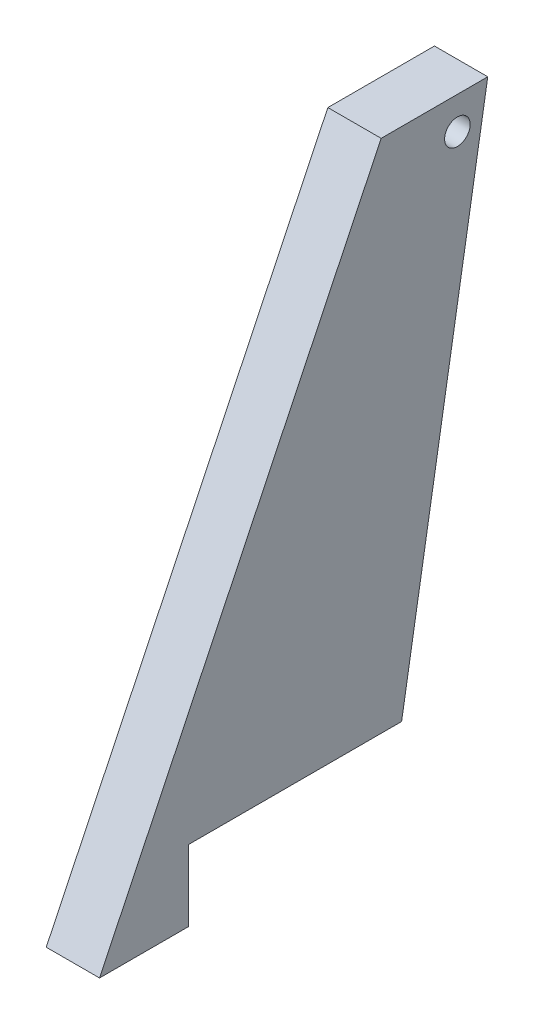
ISO-10303-21;
HEADER;
FILE_DESCRIPTION(('STEP AP214'),'2;1');
FILE_NAME('part.step','',(''),(''),'','','');
FILE_SCHEMA(('AUTOMOTIVE_DESIGN { 1 0 10303 214 1 1 1 1 }'));
ENDSEC;
DATA;
#1=APPLICATION_CONTEXT('core data for automotive mechanical design processes');
#2=APPLICATION_PROTOCOL_DEFINITION('international standard','automotive_design',2000,#1);
#3=PRODUCT_CONTEXT('',#1,'mechanical');
#4=PRODUCT('Part','Part','',(#3));
#5=PRODUCT_RELATED_PRODUCT_CATEGORY('part','',(#4));
#6=PRODUCT_DEFINITION_FORMATION('','',#4);
#7=PRODUCT_DEFINITION_CONTEXT('part definition',#1,'design');
#8=PRODUCT_DEFINITION('design','',#6,#7);
#9=PRODUCT_DEFINITION_SHAPE('','',#8);
#10=(LENGTH_UNIT() NAMED_UNIT(*) SI_UNIT(.MILLI.,.METRE.));
#11=(NAMED_UNIT(*) PLANE_ANGLE_UNIT() SI_UNIT($,.RADIAN.));
#12=(NAMED_UNIT(*) SI_UNIT($,.STERADIAN.) SOLID_ANGLE_UNIT());
#13=UNCERTAINTY_MEASURE_WITH_UNIT(LENGTH_MEASURE(1.E-05),#10,'distance_accuracy_value','');
#14=(GEOMETRIC_REPRESENTATION_CONTEXT(3) GLOBAL_UNCERTAINTY_ASSIGNED_CONTEXT((#13)) GLOBAL_UNIT_ASSIGNED_CONTEXT((#10,
#11,#12)) REPRESENTATION_CONTEXT('',''));
#15=CARTESIAN_POINT('',(0.,0.,0.));
#16=DIRECTION('',(0.,0.,1.));
#17=DIRECTION('',(1.,0.,0.));
#18=AXIS2_PLACEMENT_3D('',#15,#16,#17);
#19=CARTESIAN_POINT('',(9.525,12.7,0.));
#20=DIRECTION('',(0.,0.,1.));
#21=DIRECTION('',(0.,-1.,0.));
#22=AXIS2_PLACEMENT_3D('',#19,#20,#21);
#23=PLANE('',#22);
#24=DIRECTION('',(0.,1.,0.));
#25=VECTOR('',#24,1.);
#26=CARTESIAN_POINT('',(0.,12.7,0.));
#27=LINE('',#26,#25);
#28=CARTESIAN_POINT('',(0.,0.,0.));
#29=VERTEX_POINT('',#28);
#30=CARTESIAN_POINT('',(0.,12.7,0.));
#31=VERTEX_POINT('',#30);
#32=EDGE_CURVE('E123',#29,#31,#27,.T.);
#33=ORIENTED_EDGE('',*,*,#32,.T.);
#34=DIRECTION('',(-1.,0.,0.));
#35=VECTOR('',#34,1.);
#36=CARTESIAN_POINT('',(9.525,12.7,0.));
#37=LINE('',#36,#35);
#38=CARTESIAN_POINT('',(9.525,12.7,0.));
#39=VERTEX_POINT('',#38);
#40=EDGE_CURVE('E11',#39,#31,#37,.T.);
#41=ORIENTED_EDGE('',*,*,#40,.F.);
#42=DIRECTION('',(0.,1.,0.));
#43=VECTOR('',#42,1.);
#44=CARTESIAN_POINT('',(9.525,12.7,0.));
#45=LINE('',#44,#43);
#46=CARTESIAN_POINT('',(9.525,0.,0.));
#47=VERTEX_POINT('',#46);
#48=EDGE_CURVE('E134',#47,#39,#45,.T.);
#49=ORIENTED_EDGE('',*,*,#48,.F.);
#50=DIRECTION('',(-1.,0.,0.));
#51=VECTOR('',#50,1.);
#52=CARTESIAN_POINT('',(9.525,0.,0.));
#53=LINE('',#52,#51);
#54=EDGE_CURVE('E119',#47,#29,#53,.T.);
#55=ORIENTED_EDGE('',*,*,#54,.T.);
#56=EDGE_LOOP('',(#33,#41,#49,#55));
#57=FACE_BOUND('',#56,.T.);
#58=ADVANCED_FACE('F39',(#57),#23,.F.);
#59=CARTESIAN_POINT('',(9.525,12.7,0.));
#60=DIRECTION('',(0.,1.,0.));
#61=DIRECTION('',(0.,0.,1.));
#62=AXIS2_PLACEMENT_3D('',#59,#60,#61);
#63=PLANE('',#62);
#64=DIRECTION('',(0.,0.,-1.));
#65=VECTOR('',#64,1.);
#66=CARTESIAN_POINT('',(0.,12.7,0.));
#67=LINE('',#66,#65);
#68=CARTESIAN_POINT('',(0.,12.7,-38.1));
#69=VERTEX_POINT('',#68);
#70=EDGE_CURVE('E126',#31,#69,#67,.T.);
#71=ORIENTED_EDGE('',*,*,#70,.T.);
#72=DIRECTION('',(-1.,0.,0.));
#73=VECTOR('',#72,1.);
#74=CARTESIAN_POINT('',(9.525,12.7,-38.1));
#75=LINE('',#74,#73);
#76=CARTESIAN_POINT('',(9.525,12.7,-38.1));
#77=VERTEX_POINT('',#76);
#78=EDGE_CURVE('E47',#77,#69,#75,.T.);
#79=ORIENTED_EDGE('',*,*,#78,.F.);
#80=DIRECTION('',(0.,0.,-1.));
#81=VECTOR('',#80,1.);
#82=CARTESIAN_POINT('',(9.525,12.7,0.));
#83=LINE('',#82,#81);
#84=EDGE_CURVE('E92',#39,#77,#83,.T.);
#85=ORIENTED_EDGE('',*,*,#84,.F.);
#86=ORIENTED_EDGE('',*,*,#40,.T.);
#87=EDGE_LOOP('',(#71,#79,#85,#86));
#88=FACE_BOUND('',#87,.T.);
#89=ADVANCED_FACE('F159',(#88),#63,.F.);
#90=CARTESIAN_POINT('',(9.525,12.7,-38.1));
#91=DIRECTION('',(0.,0.164906025181086,0.986309283571322));
#92=DIRECTION('',(0.,-0.986309283571322,0.164906025181086));
#93=AXIS2_PLACEMENT_3D('',#90,#91,#92);
#94=PLANE('',#93);
#95=DIRECTION('',(0.,0.986309283571322,-0.164906025181086));
#96=VECTOR('',#95,1.);
#97=CARTESIAN_POINT('',(0.,12.7,-38.1));
#98=LINE('',#97,#96);
#99=CARTESIAN_POINT('',(0.,104.775,-53.494483780554));
#100=VERTEX_POINT('',#99);
#101=EDGE_CURVE('E129',#69,#100,#98,.T.);
#102=ORIENTED_EDGE('',*,*,#101,.T.);
#103=DIRECTION('',(-1.,0.,0.));
#104=VECTOR('',#103,1.);
#105=CARTESIAN_POINT('',(9.525,104.775,-53.494483780554));
#106=LINE('',#105,#104);
#107=CARTESIAN_POINT('',(9.525,104.775,-53.494483780554));
#108=VERTEX_POINT('',#107);
#109=EDGE_CURVE('E114',#108,#100,#106,.T.);
#110=ORIENTED_EDGE('',*,*,#109,.F.);
#111=DIRECTION('',(0.,0.986309283571322,-0.164906025181086));
#112=VECTOR('',#111,1.);
#113=CARTESIAN_POINT('',(9.525,12.7,-38.1));
#114=LINE('',#113,#112);
#115=EDGE_CURVE('E105',#77,#108,#114,.T.);
#116=ORIENTED_EDGE('',*,*,#115,.F.);
#117=ORIENTED_EDGE('',*,*,#78,.T.);
#118=EDGE_LOOP('',(#102,#110,#116,#117));
#119=FACE_BOUND('',#118,.T.);
#120=ADVANCED_FACE('F140',(#119),#94,.F.);
#121=CARTESIAN_POINT('',(9.525,104.775,-53.494483780554));
#122=DIRECTION('',(0.,-1.,0.));
#123=DIRECTION('',(0.,0.,-1.));
#124=AXIS2_PLACEMENT_3D('',#121,#122,#123);
#125=PLANE('',#124);
#126=DIRECTION('',(0.,0.,1.));
#127=VECTOR('',#126,1.);
#128=CARTESIAN_POINT('',(0.,104.775,-53.494483780554));
#129=LINE('',#128,#127);
#130=CARTESIAN_POINT('',(0.,104.775,-34.444483780554));
#131=VERTEX_POINT('',#130);
#132=EDGE_CURVE('E113',#100,#131,#129,.T.);
#133=ORIENTED_EDGE('',*,*,#132,.T.);
#134=DIRECTION('',(-1.,0.,0.));
#135=VECTOR('',#134,1.);
#136=CARTESIAN_POINT('',(9.525,104.775,-34.444483780554));
#137=LINE('',#136,#135);
#138=CARTESIAN_POINT('',(9.525,104.775,-34.444483780554));
#139=VERTEX_POINT('',#138);
#140=EDGE_CURVE('E110',#139,#131,#137,.T.);
#141=ORIENTED_EDGE('',*,*,#140,.F.);
#142=DIRECTION('',(0.,0.,1.));
#143=VECTOR('',#142,1.);
#144=CARTESIAN_POINT('',(9.525,104.775,-53.494483780554));
#145=LINE('',#144,#143);
#146=EDGE_CURVE('E99',#108,#139,#145,.T.);
#147=ORIENTED_EDGE('',*,*,#146,.F.);
#148=ORIENTED_EDGE('',*,*,#109,.T.);
#149=EDGE_LOOP('',(#133,#141,#147,#148));
#150=FACE_BOUND('',#149,.T.);
#151=ADVANCED_FACE('F111',(#150),#125,.F.);
#152=CARTESIAN_POINT('',(9.525,0.,15.875));
#153=DIRECTION('',(0.,-0.432923236283564,-0.901430791290027));
#154=DIRECTION('',(0.,0.901430791290027,-0.432923236283564));
#155=AXIS2_PLACEMENT_3D('',#152,#153,#154);
#156=PLANE('',#155);
#157=DIRECTION('',(0.,-0.901430791290027,0.432923236283565));
#158=VECTOR('',#157,1.);
#159=CARTESIAN_POINT('',(0.,0.,15.875));
#160=LINE('',#159,#158);
#161=CARTESIAN_POINT('',(0.,0.,15.875));
#162=VERTEX_POINT('',#161);
#163=EDGE_CURVE('E78',#131,#162,#160,.T.);
#164=ORIENTED_EDGE('',*,*,#163,.T.);
#165=DIRECTION('',(-1.,0.,0.));
#166=VECTOR('',#165,1.);
#167=CARTESIAN_POINT('',(9.525,0.,15.875));
#168=LINE('',#167,#166);
#169=CARTESIAN_POINT('',(9.525,0.,15.875));
#170=VERTEX_POINT('',#169);
#171=EDGE_CURVE('E115',#170,#162,#168,.T.);
#172=ORIENTED_EDGE('',*,*,#171,.F.);
#173=DIRECTION('',(0.,-0.901430791290027,0.432923236283565));
#174=VECTOR('',#173,1.);
#175=CARTESIAN_POINT('',(9.525,0.,15.875));
#176=LINE('',#175,#174);
#177=EDGE_CURVE('E103',#139,#170,#176,.T.);
#178=ORIENTED_EDGE('',*,*,#177,.F.);
#179=ORIENTED_EDGE('',*,*,#140,.T.);
#180=EDGE_LOOP('',(#164,#172,#178,#179));
#181=FACE_BOUND('',#180,.T.);
#182=ADVANCED_FACE('F117',(#181),#156,.F.);
#183=CARTESIAN_POINT('',(9.525,0.,0.));
#184=DIRECTION('',(0.,1.,0.));
#185=DIRECTION('',(0.,0.,1.));
#186=AXIS2_PLACEMENT_3D('',#183,#184,#185);
#187=PLANE('',#186);
#188=DIRECTION('',(0.,0.,-1.));
#189=VECTOR('',#188,1.);
#190=CARTESIAN_POINT('',(0.,0.,0.));
#191=LINE('',#190,#189);
#192=EDGE_CURVE('E84',#162,#29,#191,.T.);
#193=ORIENTED_EDGE('',*,*,#192,.T.);
#194=ORIENTED_EDGE('',*,*,#54,.F.);
#195=DIRECTION('',(0.,0.,-1.));
#196=VECTOR('',#195,1.);
#197=CARTESIAN_POINT('',(9.525,0.,0.));
#198=LINE('',#197,#196);
#199=EDGE_CURVE('E55',#170,#47,#198,.T.);
#200=ORIENTED_EDGE('',*,*,#199,.F.);
#201=ORIENTED_EDGE('',*,*,#171,.T.);
#202=EDGE_LOOP('',(#193,#194,#200,#201));
#203=FACE_BOUND('',#202,.T.);
#204=ADVANCED_FACE('F147',(#203),#187,.F.);
#205=CARTESIAN_POINT('',(9.525,0.,0.));
#206=DIRECTION('',(-1.,0.,0.));
#207=DIRECTION('',(0.,0.,1.));
#208=AXIS2_PLACEMENT_3D('',#205,#206,#207);
#209=PLANE('',#208);
#210=CARTESIAN_POINT('',(9.525,98.9886403156559,-48.0671622489861));
#211=DIRECTION('',(-1.,0.,0.));
#212=DIRECTION('',(0.,0.,1.));
#213=AXIS2_PLACEMENT_3D('',#210,#211,#212);
#214=CIRCLE('',#213,2.28599999999999);
#215=CARTESIAN_POINT('',(9.525,98.9886403156559,-45.7811622489861));
#216=VERTEX_POINT('',#215);
#217=EDGE_CURVE('E127',#216,#216,#214,.T.);
#218=ORIENTED_EDGE('',*,*,#217,.T.);
#219=EDGE_LOOP('',(#218));
#220=FACE_BOUND('',#219,.T.);
#221=ORIENTED_EDGE('',*,*,#48,.T.);
#222=ORIENTED_EDGE('',*,*,#84,.T.);
#223=ORIENTED_EDGE('',*,*,#115,.T.);
#224=ORIENTED_EDGE('',*,*,#146,.T.);
#225=ORIENTED_EDGE('',*,*,#177,.T.);
#226=ORIENTED_EDGE('',*,*,#199,.T.);
#227=EDGE_LOOP('',(#221,#222,#223,#224,#225,#226));
#228=FACE_BOUND('',#227,.T.);
#229=ADVANCED_FACE('F101',(#220,#228),#209,.F.);
#230=CARTESIAN_POINT('',(0.,0.,0.));
#231=DIRECTION('',(-1.,0.,0.));
#232=DIRECTION('',(0.,0.,1.));
#233=AXIS2_PLACEMENT_3D('',#230,#231,#232);
#234=PLANE('',#233);
#235=CARTESIAN_POINT('',(0.,98.9886403156559,-48.0671622489861));
#236=DIRECTION('',(-1.,0.,0.));
#237=DIRECTION('',(0.,0.,1.));
#238=AXIS2_PLACEMENT_3D('',#235,#236,#237);
#239=CIRCLE('',#238,2.28599999999999);
#240=CARTESIAN_POINT('',(0.,98.9886403156559,-45.7811622489861));
#241=VERTEX_POINT('',#240);
#242=EDGE_CURVE('E215',#241,#241,#239,.T.);
#243=ORIENTED_EDGE('',*,*,#242,.F.);
#244=EDGE_LOOP('',(#243));
#245=FACE_BOUND('',#244,.T.);
#246=ORIENTED_EDGE('',*,*,#32,.F.);
#247=ORIENTED_EDGE('',*,*,#192,.F.);
#248=ORIENTED_EDGE('',*,*,#163,.F.);
#249=ORIENTED_EDGE('',*,*,#132,.F.);
#250=ORIENTED_EDGE('',*,*,#101,.F.);
#251=ORIENTED_EDGE('',*,*,#70,.F.);
#252=EDGE_LOOP('',(#246,#247,#248,#249,#250,#251));
#253=FACE_BOUND('',#252,.T.);
#254=ADVANCED_FACE('F143',(#245,#253),#234,.T.);
#255=CARTESIAN_POINT('',(9.525,98.9886403156559,-48.0671622489861));
#256=DIRECTION('',(-1.,0.,0.));
#257=DIRECTION('',(0.,0.,1.));
#258=AXIS2_PLACEMENT_3D('',#255,#256,#257);
#259=CYLINDRICAL_SURFACE('',#258,2.28599999999999);
#260=CARTESIAN_POINT('',(9.525,98.9886403156559,-45.7811622489861));
#261=CARTESIAN_POINT('',(9.42578125,98.9886403156559,-45.7811622489861));
#262=CARTESIAN_POINT('',(9.3265625,98.9886403156559,-45.7811622489861));
#263=CARTESIAN_POINT('',(9.128125,98.9886403156559,-45.7811622489861));
#264=CARTESIAN_POINT('',(9.02890625,98.9886403156559,-45.7811622489861));
#265=CARTESIAN_POINT('',(8.83046875,98.9886403156559,-45.7811622489861));
#266=CARTESIAN_POINT('',(8.73125,98.9886403156559,-45.7811622489861));
#267=CARTESIAN_POINT('',(8.5328125,98.9886403156559,-45.7811622489861));
#268=CARTESIAN_POINT('',(8.43359375,98.9886403156559,-45.7811622489861));
#269=CARTESIAN_POINT('',(8.23515625,98.9886403156559,-45.7811622489861));
#270=CARTESIAN_POINT('',(8.1359375,98.9886403156559,-45.7811622489861));
#271=CARTESIAN_POINT('',(7.9375,98.9886403156559,-45.7811622489861));
#272=CARTESIAN_POINT('',(7.83828125,98.9886403156559,-45.7811622489861));
#273=CARTESIAN_POINT('',(7.63984375,98.9886403156559,-45.7811622489861));
#274=CARTESIAN_POINT('',(7.540625,98.9886403156559,-45.7811622489861));
#275=CARTESIAN_POINT('',(7.3421875,98.9886403156559,-45.7811622489861));
#276=CARTESIAN_POINT('',(7.24296875,98.9886403156559,-45.7811622489861));
#277=CARTESIAN_POINT('',(7.04453125,98.9886403156559,-45.7811622489861));
#278=CARTESIAN_POINT('',(6.9453125,98.9886403156559,-45.7811622489861));
#279=CARTESIAN_POINT('',(6.746875,98.9886403156559,-45.7811622489861));
#280=CARTESIAN_POINT('',(6.64765625,98.9886403156559,-45.7811622489861));
#281=CARTESIAN_POINT('',(6.44921875,98.9886403156559,-45.7811622489861));
#282=CARTESIAN_POINT('',(6.35,98.9886403156559,-45.7811622489861));
#283=CARTESIAN_POINT('',(6.1515625,98.9886403156559,-45.7811622489861));
#284=CARTESIAN_POINT('',(6.05234375,98.9886403156559,-45.7811622489861));
#285=CARTESIAN_POINT('',(5.85390625,98.9886403156559,-45.7811622489861));
#286=CARTESIAN_POINT('',(5.7546875,98.9886403156559,-45.7811622489861));
#287=CARTESIAN_POINT('',(5.55625,98.9886403156559,-45.7811622489861));
#288=CARTESIAN_POINT('',(5.45703125,98.9886403156559,-45.7811622489861));
#289=CARTESIAN_POINT('',(5.25859375,98.9886403156559,-45.7811622489861));
#290=CARTESIAN_POINT('',(5.159375,98.9886403156559,-45.7811622489861));
#291=CARTESIAN_POINT('',(4.9609375,98.9886403156559,-45.7811622489861));
#292=CARTESIAN_POINT('',(4.86171875,98.9886403156559,-45.7811622489861));
#293=CARTESIAN_POINT('',(4.66328125,98.9886403156559,-45.7811622489861));
#294=CARTESIAN_POINT('',(4.5640625,98.9886403156559,-45.7811622489861));
#295=CARTESIAN_POINT('',(4.365625,98.9886403156559,-45.7811622489861));
#296=CARTESIAN_POINT('',(4.26640625,98.9886403156559,-45.7811622489861));
#297=CARTESIAN_POINT('',(4.06796875,98.9886403156559,-45.7811622489861));
#298=CARTESIAN_POINT('',(3.96875,98.9886403156559,-45.7811622489861));
#299=CARTESIAN_POINT('',(3.7703125,98.9886403156559,-45.7811622489861));
#300=CARTESIAN_POINT('',(3.67109375,98.9886403156559,-45.7811622489861));
#301=CARTESIAN_POINT('',(3.47265625,98.9886403156559,-45.7811622489861));
#302=CARTESIAN_POINT('',(3.3734375,98.9886403156559,-45.7811622489861));
#303=CARTESIAN_POINT('',(3.175,98.9886403156559,-45.7811622489861));
#304=CARTESIAN_POINT('',(3.07578125,98.9886403156559,-45.7811622489861));
#305=CARTESIAN_POINT('',(2.87734375,98.9886403156559,-45.7811622489861));
#306=CARTESIAN_POINT('',(2.778125,98.9886403156559,-45.7811622489861));
#307=CARTESIAN_POINT('',(2.5796875,98.9886403156559,-45.7811622489861));
#308=CARTESIAN_POINT('',(2.48046875,98.9886403156559,-45.7811622489861));
#309=CARTESIAN_POINT('',(2.28203125,98.9886403156559,-45.7811622489861));
#310=CARTESIAN_POINT('',(2.1828125,98.9886403156559,-45.7811622489861));
#311=CARTESIAN_POINT('',(1.984375,98.9886403156559,-45.7811622489861));
#312=CARTESIAN_POINT('',(1.88515625,98.9886403156559,-45.7811622489861));
#313=CARTESIAN_POINT('',(1.68671875,98.9886403156559,-45.7811622489861));
#314=CARTESIAN_POINT('',(1.5875,98.9886403156559,-45.7811622489861));
#315=CARTESIAN_POINT('',(1.3890625,98.9886403156559,-45.7811622489861));
#316=CARTESIAN_POINT('',(1.28984375,98.9886403156559,-45.7811622489861));
#317=CARTESIAN_POINT('',(1.09140625,98.9886403156559,-45.7811622489861));
#318=CARTESIAN_POINT('',(0.992187500000001,98.9886403156559,-45.7811622489861));
#319=CARTESIAN_POINT('',(0.793750000000001,98.9886403156559,-45.7811622489861));
#320=CARTESIAN_POINT('',(0.69453125,98.9886403156559,-45.7811622489861));
#321=CARTESIAN_POINT('',(0.49609375,98.9886403156559,-45.7811622489861));
#322=CARTESIAN_POINT('',(0.396875,98.9886403156559,-45.7811622489861));
#323=CARTESIAN_POINT('',(0.1984375,98.9886403156559,-45.7811622489861));
#324=CARTESIAN_POINT('',(0.0992187500000001,98.9886403156559,-45.7811622489861));
#325=CARTESIAN_POINT('',(0.,98.9886403156559,-45.7811622489861));
#326=B_SPLINE_CURVE_WITH_KNOTS('',3,(#260,#261,#262,#263,#264,#265,#266,#267,#268,#269,#270,
#271,#272,#273,#274,#275,#276,#277,#278,#279,#280,#281,#282,#283,#284,#285,#286,#287,#288,#289,
#290,#291,#292,#293,#294,#295,#296,#297,#298,#299,#300,#301,#302,#303,#304,#305,#306,#307,#308,
#309,#310,#311,#312,#313,#314,#315,#316,#317,#318,#319,#320,#321,#322,#323,#324,#325),
.UNSPECIFIED.,.F.,.F.,(4,2,2,2,2,2,2,2,2,2,2,2,2,2,2,2,2,2,2,2,2,2,2,2,2,2,2,2,2,2,2,2,4),(0.,
0.29765625,0.5953125,0.892968750000001,1.190625,1.48828125,1.7859375,2.08359375,2.38125,
2.67890625,2.9765625,3.27421875,3.571875,3.86953125,4.1671875,4.46484375,4.7625,5.06015625,
5.3578125,5.65546875,5.953125,6.25078125,6.5484375,6.84609375,7.14375,7.44140625,7.7390625,
8.03671875,8.334375,8.63203125,8.9296875,9.22734375,9.525),.UNSPECIFIED.);
#327=EDGE_CURVE('BSEAM198',#216,#241,#326,.T.);
#328=ORIENTED_EDGE('',*,*,#217,.F.);
#329=ORIENTED_EDGE('',*,*,#242,.T.);
#330=ORIENTED_EDGE('',*,*,#327,.T.);
#331=ORIENTED_EDGE('',*,*,#327,.F.);
#332=EDGE_LOOP('',(#328,#330,#329,#331));
#333=FACE_BOUND('',#332,.T.);
#334=ADVANCED_FACE('F198',(#333),#259,.F.);
#335=CLOSED_SHELL('',(#58,#89,#120,#151,#182,#204,#229,#254,#334));
#336=MANIFOLD_SOLID_BREP('B2',#335);
#337=ADVANCED_BREP_SHAPE_REPRESENTATION('',(#18,#336),#14);
#338=SHAPE_DEFINITION_REPRESENTATION(#9,#337);
ENDSEC;
END-ISO-10303-21;
